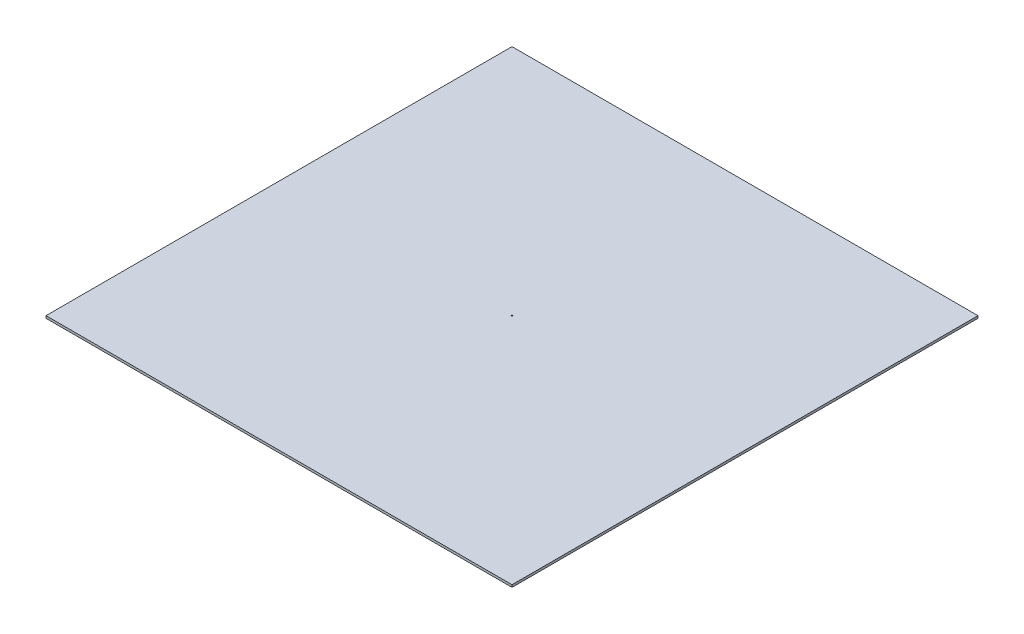
ISO-10303-21;
HEADER;
FILE_DESCRIPTION(('STEP AP214'),'2;1');
FILE_NAME('part.step','',(''),(''),'','','');
FILE_SCHEMA(('AUTOMOTIVE_DESIGN { 1 0 10303 214 1 1 1 1 }'));
ENDSEC;
DATA;
#1=APPLICATION_CONTEXT('core data for automotive mechanical design processes');
#2=APPLICATION_PROTOCOL_DEFINITION('international standard','automotive_design',2000,#1);
#3=PRODUCT_CONTEXT('',#1,'mechanical');
#4=PRODUCT('Part','Part','',(#3));
#5=PRODUCT_RELATED_PRODUCT_CATEGORY('part','',(#4));
#6=PRODUCT_DEFINITION_FORMATION('','',#4);
#7=PRODUCT_DEFINITION_CONTEXT('part definition',#1,'design');
#8=PRODUCT_DEFINITION('design','',#6,#7);
#9=PRODUCT_DEFINITION_SHAPE('','',#8);
#10=(LENGTH_UNIT() NAMED_UNIT(*) SI_UNIT(.MILLI.,.METRE.));
#11=(NAMED_UNIT(*) PLANE_ANGLE_UNIT() SI_UNIT($,.RADIAN.));
#12=(NAMED_UNIT(*) SI_UNIT($,.STERADIAN.) SOLID_ANGLE_UNIT());
#13=UNCERTAINTY_MEASURE_WITH_UNIT(LENGTH_MEASURE(1.E-05),#10,'distance_accuracy_value','');
#14=(GEOMETRIC_REPRESENTATION_CONTEXT(3) GLOBAL_UNCERTAINTY_ASSIGNED_CONTEXT((#13)) GLOBAL_UNIT_ASSIGNED_CONTEXT((#10,
#11,#12)) REPRESENTATION_CONTEXT('',''));
#15=CARTESIAN_POINT('',(0.,0.,0.));
#16=DIRECTION('',(0.,0.,1.));
#17=DIRECTION('',(1.,0.,0.));
#18=AXIS2_PLACEMENT_3D('',#15,#16,#17);
#19=CARTESIAN_POINT('',(0.,10.,0.));
#20=DIRECTION('',(0.,1.,0.));
#21=DIRECTION('',(0.,0.,1.));
#22=AXIS2_PLACEMENT_3D('',#19,#20,#21);
#23=PLANE('',#22);
#24=DIRECTION('',(0.,0.,1.));
#25=VECTOR('',#24,1.);
#26=CARTESIAN_POINT('',(-1000.,10.,1000.));
#27=LINE('',#26,#25);
#28=CARTESIAN_POINT('',(-1000.,10.,-1000.));
#29=VERTEX_POINT('',#28);
#30=CARTESIAN_POINT('',(-1000.,10.,1000.));
#31=VERTEX_POINT('',#30);
#32=EDGE_CURVE('E91',#29,#31,#27,.T.);
#33=ORIENTED_EDGE('',*,*,#32,.T.);
#34=DIRECTION('',(1.,0.,0.));
#35=VECTOR('',#34,1.);
#36=CARTESIAN_POINT('',(1000.,10.,1000.));
#37=LINE('',#36,#35);
#38=CARTESIAN_POINT('',(1000.,10.,1000.));
#39=VERTEX_POINT('',#38);
#40=EDGE_CURVE('E86',#31,#39,#37,.T.);
#41=ORIENTED_EDGE('',*,*,#40,.T.);
#42=DIRECTION('',(0.,0.,-1.));
#43=VECTOR('',#42,1.);
#44=CARTESIAN_POINT('',(1000.,10.,1000.));
#45=LINE('',#44,#43);
#46=CARTESIAN_POINT('',(1000.,10.,-1000.));
#47=VERTEX_POINT('',#46);
#48=EDGE_CURVE('E89',#39,#47,#45,.T.);
#49=ORIENTED_EDGE('',*,*,#48,.T.);
#50=DIRECTION('',(-1.,0.,0.));
#51=VECTOR('',#50,1.);
#52=CARTESIAN_POINT('',(1000.,10.,-1000.));
#53=LINE('',#52,#51);
#54=EDGE_CURVE('E56',#47,#29,#53,.T.);
#55=ORIENTED_EDGE('',*,*,#54,.T.);
#56=EDGE_LOOP('',(#33,#41,#49,#55));
#57=FACE_BOUND('',#56,.T.);
#58=CARTESIAN_POINT('',(1.11022302462516E-13,10.,1.11022302462516E-13));
#59=DIRECTION('',(0.,1.,0.));
#60=DIRECTION('',(0.,0.,1.));
#61=AXIS2_PLACEMENT_3D('',#58,#59,#60);
#62=CIRCLE('',#61,2.5);
#63=CARTESIAN_POINT('',(1.11022302462516E-13,10.,2.50000000000011));
#64=VERTEX_POINT('',#63);
#65=EDGE_CURVE('E106',#64,#64,#62,.T.);
#66=ORIENTED_EDGE('',*,*,#65,.F.);
#67=EDGE_LOOP('',(#66));
#68=FACE_BOUND('',#67,.T.);
#69=ADVANCED_FACE('F39',(#57,#68),#23,.T.);
#70=CARTESIAN_POINT('',(0.,0.,0.));
#71=DIRECTION('',(0.,1.,0.));
#72=DIRECTION('',(0.,0.,1.));
#73=AXIS2_PLACEMENT_3D('',#70,#71,#72);
#74=PLANE('',#73);
#75=DIRECTION('',(0.,0.,1.));
#76=VECTOR('',#75,1.);
#77=CARTESIAN_POINT('',(-1000.,0.,1000.));
#78=LINE('',#77,#76);
#79=CARTESIAN_POINT('',(-1000.,0.,-1000.));
#80=VERTEX_POINT('',#79);
#81=CARTESIAN_POINT('',(-1000.,0.,1000.));
#82=VERTEX_POINT('',#81);
#83=EDGE_CURVE('E103',#80,#82,#78,.T.);
#84=ORIENTED_EDGE('',*,*,#83,.F.);
#85=DIRECTION('',(-1.,0.,0.));
#86=VECTOR('',#85,1.);
#87=CARTESIAN_POINT('',(1000.,0.,-1000.));
#88=LINE('',#87,#86);
#89=CARTESIAN_POINT('',(1000.,0.,-1000.));
#90=VERTEX_POINT('',#89);
#91=EDGE_CURVE('E79',#90,#80,#88,.T.);
#92=ORIENTED_EDGE('',*,*,#91,.F.);
#93=DIRECTION('',(0.,0.,-1.));
#94=VECTOR('',#93,1.);
#95=CARTESIAN_POINT('',(1000.,0.,1000.));
#96=LINE('',#95,#94);
#97=CARTESIAN_POINT('',(1000.,0.,1000.));
#98=VERTEX_POINT('',#97);
#99=EDGE_CURVE('E73',#98,#90,#96,.T.);
#100=ORIENTED_EDGE('',*,*,#99,.F.);
#101=DIRECTION('',(1.,0.,0.));
#102=VECTOR('',#101,1.);
#103=CARTESIAN_POINT('',(1000.,0.,1000.));
#104=LINE('',#103,#102);
#105=EDGE_CURVE('E95',#82,#98,#104,.T.);
#106=ORIENTED_EDGE('',*,*,#105,.F.);
#107=EDGE_LOOP('',(#84,#92,#100,#106));
#108=FACE_BOUND('',#107,.T.);
#109=CARTESIAN_POINT('',(1.11022302462516E-13,0.,1.11022302462516E-13));
#110=DIRECTION('',(0.,1.,0.));
#111=DIRECTION('',(0.,0.,1.));
#112=AXIS2_PLACEMENT_3D('',#109,#110,#111);
#113=CIRCLE('',#112,2.5);
#114=CARTESIAN_POINT('',(1.11022302462516E-13,0.,2.50000000000011));
#115=VERTEX_POINT('',#114);
#116=EDGE_CURVE('E118',#115,#115,#113,.T.);
#117=ORIENTED_EDGE('',*,*,#116,.T.);
#118=EDGE_LOOP('',(#117));
#119=FACE_BOUND('',#118,.T.);
#120=ADVANCED_FACE('F114',(#108,#119),#74,.F.);
#121=CARTESIAN_POINT('',(-1000.,10.,1000.));
#122=DIRECTION('',(1.,0.,0.));
#123=DIRECTION('',(0.,0.,-1.));
#124=AXIS2_PLACEMENT_3D('',#121,#122,#123);
#125=PLANE('',#124);
#126=ORIENTED_EDGE('',*,*,#83,.T.);
#127=DIRECTION('',(0.,-1.,0.));
#128=VECTOR('',#127,1.);
#129=CARTESIAN_POINT('',(-1000.,10.,1000.));
#130=LINE('',#129,#128);
#131=EDGE_CURVE('E11',#31,#82,#130,.T.);
#132=ORIENTED_EDGE('',*,*,#131,.F.);
#133=ORIENTED_EDGE('',*,*,#32,.F.);
#134=DIRECTION('',(0.,-1.,0.));
#135=VECTOR('',#134,1.);
#136=CARTESIAN_POINT('',(-1000.,10.,-1000.));
#137=LINE('',#136,#135);
#138=EDGE_CURVE('E99',#29,#80,#137,.T.);
#139=ORIENTED_EDGE('',*,*,#138,.T.);
#140=EDGE_LOOP('',(#126,#132,#133,#139));
#141=FACE_BOUND('',#140,.T.);
#142=ADVANCED_FACE('F41',(#141),#125,.F.);
#143=CARTESIAN_POINT('',(1000.,10.,1000.));
#144=DIRECTION('',(0.,0.,-1.));
#145=DIRECTION('',(-1.,0.,0.));
#146=AXIS2_PLACEMENT_3D('',#143,#144,#145);
#147=PLANE('',#146);
#148=ORIENTED_EDGE('',*,*,#105,.T.);
#149=DIRECTION('',(0.,-1.,0.));
#150=VECTOR('',#149,1.);
#151=CARTESIAN_POINT('',(1000.,10.,1000.));
#152=LINE('',#151,#150);
#153=EDGE_CURVE('E48',#39,#98,#152,.T.);
#154=ORIENTED_EDGE('',*,*,#153,.F.);
#155=ORIENTED_EDGE('',*,*,#40,.F.);
#156=ORIENTED_EDGE('',*,*,#131,.T.);
#157=EDGE_LOOP('',(#148,#154,#155,#156));
#158=FACE_BOUND('',#157,.T.);
#159=ADVANCED_FACE('F94',(#158),#147,.F.);
#160=CARTESIAN_POINT('',(1000.,10.,1000.));
#161=DIRECTION('',(-1.,0.,0.));
#162=DIRECTION('',(0.,0.,1.));
#163=AXIS2_PLACEMENT_3D('',#160,#161,#162);
#164=PLANE('',#163);
#165=ORIENTED_EDGE('',*,*,#99,.T.);
#166=DIRECTION('',(0.,-1.,0.));
#167=VECTOR('',#166,1.);
#168=CARTESIAN_POINT('',(1000.,10.,-1000.));
#169=LINE('',#168,#167);
#170=EDGE_CURVE('E96',#47,#90,#169,.T.);
#171=ORIENTED_EDGE('',*,*,#170,.F.);
#172=ORIENTED_EDGE('',*,*,#48,.F.);
#173=ORIENTED_EDGE('',*,*,#153,.T.);
#174=EDGE_LOOP('',(#165,#171,#172,#173));
#175=FACE_BOUND('',#174,.T.);
#176=ADVANCED_FACE('F97',(#175),#164,.F.);
#177=CARTESIAN_POINT('',(1000.,10.,-1000.));
#178=DIRECTION('',(0.,0.,1.));
#179=DIRECTION('',(1.,0.,0.));
#180=AXIS2_PLACEMENT_3D('',#177,#178,#179);
#181=PLANE('',#180);
#182=ORIENTED_EDGE('',*,*,#91,.T.);
#183=ORIENTED_EDGE('',*,*,#138,.F.);
#184=ORIENTED_EDGE('',*,*,#54,.F.);
#185=ORIENTED_EDGE('',*,*,#170,.T.);
#186=EDGE_LOOP('',(#182,#183,#184,#185));
#187=FACE_BOUND('',#186,.T.);
#188=ADVANCED_FACE('F111',(#187),#181,.F.);
#189=CARTESIAN_POINT('',(1.11022302462516E-13,10.,1.11022302462516E-13));
#190=DIRECTION('',(0.,-1.,0.));
#191=DIRECTION('',(0.,0.,-1.));
#192=AXIS2_PLACEMENT_3D('',#189,#190,#191);
#193=CYLINDRICAL_SURFACE('',#192,2.5);
#194=ORIENTED_EDGE('',*,*,#65,.T.);
#195=EDGE_LOOP('',(#194));
#196=FACE_BOUND('',#195,.T.);
#197=ORIENTED_EDGE('',*,*,#116,.F.);
#198=EDGE_LOOP('',(#197));
#199=FACE_BOUND('',#198,.T.);
#200=ADVANCED_FACE('F124',(#196,#199),#193,.F.);
#201=CLOSED_SHELL('',(#69,#120,#142,#159,#176,#188,#200));
#202=MANIFOLD_SOLID_BREP('B2',#201);
#203=ADVANCED_BREP_SHAPE_REPRESENTATION('',(#18,#202),#14);
#204=SHAPE_DEFINITION_REPRESENTATION(#9,#203);
ENDSEC;
END-ISO-10303-21;
